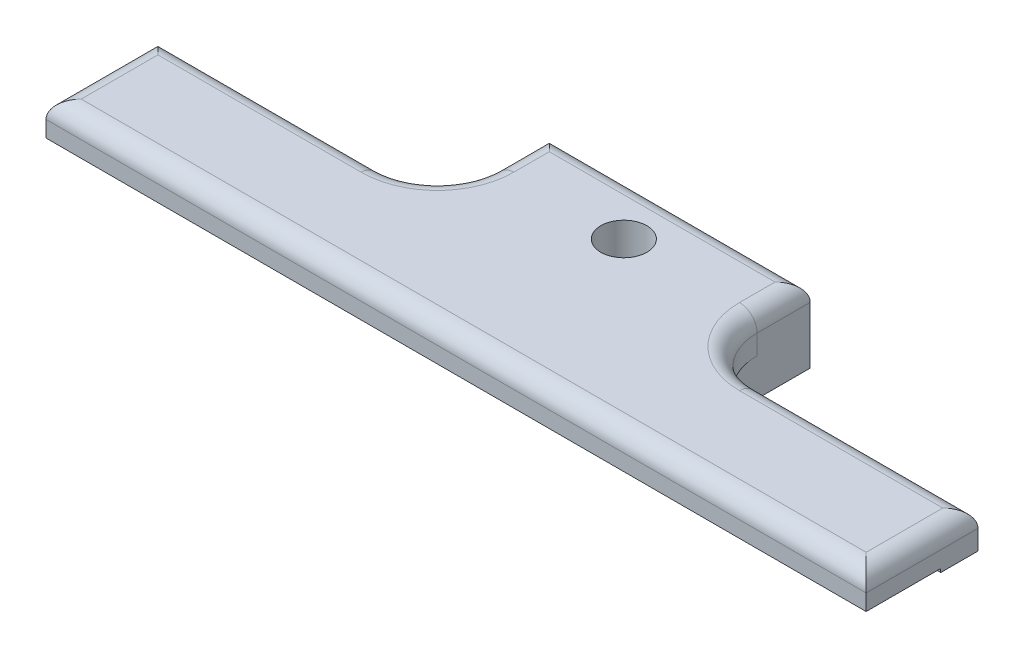
ISO-10303-21;
HEADER;
FILE_DESCRIPTION(('STEP AP214'),'2;1');
FILE_NAME('part.step','',(''),(''),'','','');
FILE_SCHEMA(('AUTOMOTIVE_DESIGN { 1 0 10303 214 1 1 1 1 }'));
ENDSEC;
DATA;
#1=APPLICATION_CONTEXT('core data for automotive mechanical design processes');
#2=APPLICATION_PROTOCOL_DEFINITION('international standard','automotive_design',2000,#1);
#3=PRODUCT_CONTEXT('',#1,'mechanical');
#4=PRODUCT('Part','Part','',(#3));
#5=PRODUCT_RELATED_PRODUCT_CATEGORY('part','',(#4));
#6=PRODUCT_DEFINITION_FORMATION('','',#4);
#7=PRODUCT_DEFINITION_CONTEXT('part definition',#1,'design');
#8=PRODUCT_DEFINITION('design','',#6,#7);
#9=PRODUCT_DEFINITION_SHAPE('','',#8);
#10=(LENGTH_UNIT() NAMED_UNIT(*) SI_UNIT(.MILLI.,.METRE.));
#11=(NAMED_UNIT(*) PLANE_ANGLE_UNIT() SI_UNIT($,.RADIAN.));
#12=(NAMED_UNIT(*) SI_UNIT($,.STERADIAN.) SOLID_ANGLE_UNIT());
#13=UNCERTAINTY_MEASURE_WITH_UNIT(LENGTH_MEASURE(1.E-05),#10,'distance_accuracy_value','');
#14=(GEOMETRIC_REPRESENTATION_CONTEXT(3) GLOBAL_UNCERTAINTY_ASSIGNED_CONTEXT((#13)) GLOBAL_UNIT_ASSIGNED_CONTEXT((#10,
#11,#12)) REPRESENTATION_CONTEXT('',''));
#15=CARTESIAN_POINT('',(0.,0.,0.));
#16=DIRECTION('',(0.,0.,1.));
#17=DIRECTION('',(1.,0.,0.));
#18=AXIS2_PLACEMENT_3D('',#15,#16,#17);
#19=CARTESIAN_POINT('',(0.,0.,0.));
#20=DIRECTION('',(0.,1.,0.));
#21=DIRECTION('',(0.,0.,1.));
#22=AXIS2_PLACEMENT_3D('',#19,#20,#21);
#23=PLANE('',#22);
#24=CARTESIAN_POINT('',(0.,0.,0.));
#25=DIRECTION('',(0.,1.,0.));
#26=DIRECTION('',(0.,0.,1.));
#27=AXIS2_PLACEMENT_3D('',#24,#25,#26);
#28=CIRCLE('',#27,3.925);
#29=CARTESIAN_POINT('',(0.,0.,3.925));
#30=VERTEX_POINT('',#29);
#31=EDGE_CURVE('E298',#30,#30,#28,.T.);
#32=ORIENTED_EDGE('',*,*,#31,.T.);
#33=EDGE_LOOP('',(#32));
#34=FACE_BOUND('',#33,.T.);
#35=DIRECTION('',(-1.,0.,0.));
#36=VECTOR('',#35,1.);
#37=CARTESIAN_POINT('',(-19.1262,0.,9.525));
#38=LINE('',#37,#36);
#39=CARTESIAN_POINT('',(-18.1262,0.,9.525));
#40=VERTEX_POINT('',#39);
#41=CARTESIAN_POINT('',(-22.225,0.,9.525));
#42=VERTEX_POINT('',#41);
#43=EDGE_CURVE('E218',#40,#42,#38,.T.);
#44=ORIENTED_EDGE('',*,*,#43,.F.);
#45=DIRECTION('',(0.,0.,1.));
#46=VECTOR('',#45,1.);
#47=CARTESIAN_POINT('',(-18.1262,0.,-9.525));
#48=LINE('',#47,#46);
#49=CARTESIAN_POINT('',(-18.1262,0.,-9.525));
#50=VERTEX_POINT('',#49);
#51=EDGE_CURVE('E482',#40,#50,#48,.F.);
#52=ORIENTED_EDGE('',*,*,#51,.T.);
#53=DIRECTION('',(1.,0.,0.));
#54=VECTOR('',#53,1.);
#55=CARTESIAN_POINT('',(0.,0.,-9.525));
#56=LINE('',#55,#54);
#57=CARTESIAN_POINT('',(18.1262,0.,-9.525));
#58=VERTEX_POINT('',#57);
#59=EDGE_CURVE('E321',#50,#58,#56,.T.);
#60=ORIENTED_EDGE('',*,*,#59,.T.);
#61=DIRECTION('',(0.,0.,1.));
#62=VECTOR('',#61,1.);
#63=CARTESIAN_POINT('',(18.1262,0.,0.));
#64=LINE('',#63,#62);
#65=CARTESIAN_POINT('',(18.1262,0.,9.525));
#66=VERTEX_POINT('',#65);
#67=EDGE_CURVE('E478',#58,#66,#64,.T.);
#68=ORIENTED_EDGE('',*,*,#67,.T.);
#69=DIRECTION('',(1.,0.,0.));
#70=VECTOR('',#69,1.);
#71=CARTESIAN_POINT('',(19.1262,0.,9.525));
#72=LINE('',#71,#70);
#73=CARTESIAN_POINT('',(22.225,0.,9.525));
#74=VERTEX_POINT('',#73);
#75=EDGE_CURVE('E230',#66,#74,#72,.T.);
#76=ORIENTED_EDGE('',*,*,#75,.T.);
#77=DIRECTION('',(0.,0.,1.));
#78=VECTOR('',#77,1.);
#79=CARTESIAN_POINT('',(22.225,0.,0.));
#80=LINE('',#79,#78);
#81=CARTESIAN_POINT('',(22.225,0.,-0.475));
#82=VERTEX_POINT('',#81);
#83=EDGE_CURVE('E214',#82,#74,#80,.T.);
#84=ORIENTED_EDGE('',*,*,#83,.F.);
#85=CARTESIAN_POINT('',(32.225,0.,-0.475));
#86=DIRECTION('',(0.,1.,0.));
#87=DIRECTION('',(0.,0.,1.));
#88=AXIS2_PLACEMENT_3D('',#85,#86,#87);
#89=CIRCLE('',#88,10.);
#90=CARTESIAN_POINT('',(32.225,0.,9.525));
#91=VERTEX_POINT('',#90);
#92=EDGE_CURVE('E369',#82,#91,#89,.T.);
#93=ORIENTED_EDGE('',*,*,#92,.T.);
#94=DIRECTION('',(1.,0.,0.));
#95=VECTOR('',#94,1.);
#96=CARTESIAN_POINT('',(0.,0.,9.525));
#97=LINE('',#96,#95);
#98=CARTESIAN_POINT('',(69.85,0.,9.525));
#99=VERTEX_POINT('',#98);
#100=EDGE_CURVE('E317',#91,#99,#97,.T.);
#101=ORIENTED_EDGE('',*,*,#100,.T.);
#102=DIRECTION('',(0.,0.,-1.));
#103=VECTOR('',#102,1.);
#104=CARTESIAN_POINT('',(69.85,0.,0.));
#105=LINE('',#104,#103);
#106=CARTESIAN_POINT('',(69.85,0.,15.875));
#107=VERTEX_POINT('',#106);
#108=EDGE_CURVE('E313',#107,#99,#105,.T.);
#109=ORIENTED_EDGE('',*,*,#108,.F.);
#110=DIRECTION('',(1.,0.,0.));
#111=VECTOR('',#110,1.);
#112=CARTESIAN_POINT('',(-69.85,0.,15.875));
#113=LINE('',#112,#111);
#114=CARTESIAN_POINT('',(-69.85,0.,15.875));
#115=VERTEX_POINT('',#114);
#116=EDGE_CURVE('E287',#115,#107,#113,.T.);
#117=ORIENTED_EDGE('',*,*,#116,.F.);
#118=DIRECTION('',(0.,0.,-1.));
#119=VECTOR('',#118,1.);
#120=CARTESIAN_POINT('',(-69.85,0.,0.));
#121=LINE('',#120,#119);
#122=CARTESIAN_POINT('',(-69.85,0.,9.525));
#123=VERTEX_POINT('',#122);
#124=EDGE_CURVE('E309',#115,#123,#121,.T.);
#125=ORIENTED_EDGE('',*,*,#124,.T.);
#126=DIRECTION('',(1.,0.,0.));
#127=VECTOR('',#126,1.);
#128=CARTESIAN_POINT('',(0.,0.,9.525));
#129=LINE('',#128,#127);
#130=CARTESIAN_POINT('',(-32.225,0.,9.525));
#131=VERTEX_POINT('',#130);
#132=EDGE_CURVE('E325',#123,#131,#129,.T.);
#133=ORIENTED_EDGE('',*,*,#132,.T.);
#134=CARTESIAN_POINT('',(-32.225,0.,-0.475000000000001));
#135=DIRECTION('',(0.,1.,0.));
#136=DIRECTION('',(0.,0.,1.));
#137=AXIS2_PLACEMENT_3D('',#134,#135,#136);
#138=CIRCLE('',#137,10.);
#139=CARTESIAN_POINT('',(-22.225,0.,-0.475000000000001));
#140=VERTEX_POINT('',#139);
#141=EDGE_CURVE('E372',#131,#140,#138,.T.);
#142=ORIENTED_EDGE('',*,*,#141,.T.);
#143=DIRECTION('',(0.,0.,-1.));
#144=VECTOR('',#143,1.);
#145=CARTESIAN_POINT('',(-22.225,0.,0.));
#146=LINE('',#145,#144);
#147=EDGE_CURVE('E365',#42,#140,#146,.T.);
#148=ORIENTED_EDGE('',*,*,#147,.F.);
#149=EDGE_LOOP('',(#44,#52,#60,#68,#76,#84,#93,#101,#109,#117,#125,#133,#142,#148));
#150=FACE_BOUND('',#149,.T.);
#151=ADVANCED_FACE('F41',(#34,#150),#23,.F.);
#152=CARTESIAN_POINT('',(0.,6.35,28.575));
#153=DIRECTION('',(0.,0.,-1.));
#154=DIRECTION('',(-1.,0.,0.));
#155=AXIS2_PLACEMENT_3D('',#152,#153,#154);
#156=PLANE('',#155);
#157=DIRECTION('',(0.,-1.,0.));
#158=VECTOR('',#157,1.);
#159=CARTESIAN_POINT('',(69.85,6.35,28.575));
#160=LINE('',#159,#158);
#161=CARTESIAN_POINT('',(69.85,3.35,28.575));
#162=VERTEX_POINT('',#161);
#163=CARTESIAN_POINT('',(69.85,0.599999999999998,28.575));
#164=VERTEX_POINT('',#163);
#165=EDGE_CURVE('E346',#162,#164,#160,.T.);
#166=ORIENTED_EDGE('',*,*,#165,.F.);
#167=DIRECTION('',(1.,0.,0.));
#168=VECTOR('',#167,1.);
#169=CARTESIAN_POINT('',(-69.85,3.35,28.575));
#170=LINE('',#169,#168);
#171=CARTESIAN_POINT('',(-69.85,3.35,28.575));
#172=VERTEX_POINT('',#171);
#173=EDGE_CURVE('E434',#162,#172,#170,.F.);
#174=ORIENTED_EDGE('',*,*,#173,.T.);
#175=DIRECTION('',(0.,-1.,0.));
#176=VECTOR('',#175,1.);
#177=CARTESIAN_POINT('',(-69.85,6.35,28.575));
#178=LINE('',#177,#176);
#179=CARTESIAN_POINT('',(-69.85,0.599999999999998,28.575));
#180=VERTEX_POINT('',#179);
#181=EDGE_CURVE('E308',#172,#180,#178,.T.);
#182=ORIENTED_EDGE('',*,*,#181,.T.);
#183=DIRECTION('',(1.,0.,0.));
#184=VECTOR('',#183,1.);
#185=CARTESIAN_POINT('',(-69.85,0.599999999999998,28.575));
#186=LINE('',#185,#184);
#187=EDGE_CURVE('E294',#180,#164,#186,.T.);
#188=ORIENTED_EDGE('',*,*,#187,.T.);
#189=EDGE_LOOP('',(#166,#174,#182,#188));
#190=FACE_BOUND('',#189,.T.);
#191=ADVANCED_FACE('F568',(#190),#156,.F.);
#192=CARTESIAN_POINT('',(69.85,6.35,0.));
#193=DIRECTION('',(-1.,0.,0.));
#194=DIRECTION('',(0.,0.,1.));
#195=AXIS2_PLACEMENT_3D('',#192,#193,#194);
#196=PLANE('',#195);
#197=DIRECTION('',(0.,-1.,0.));
#198=VECTOR('',#197,1.);
#199=CARTESIAN_POINT('',(69.85,6.35,9.525));
#200=LINE('',#199,#198);
#201=CARTESIAN_POINT('',(69.85,3.35,9.525));
#202=VERTEX_POINT('',#201);
#203=EDGE_CURVE('E343',#202,#99,#200,.T.);
#204=ORIENTED_EDGE('',*,*,#203,.F.);
#205=DIRECTION('',(0.,0.,-1.));
#206=VECTOR('',#205,1.);
#207=CARTESIAN_POINT('',(69.85,3.35,28.575));
#208=LINE('',#207,#206);
#209=EDGE_CURVE('E431',#202,#162,#208,.F.);
#210=ORIENTED_EDGE('',*,*,#209,.T.);
#211=ORIENTED_EDGE('',*,*,#165,.T.);
#212=DIRECTION('',(0.,0.,1.));
#213=VECTOR('',#212,1.);
#214=CARTESIAN_POINT('',(69.85,0.6,15.875));
#215=LINE('',#214,#213);
#216=CARTESIAN_POINT('',(69.85,0.6,15.875));
#217=VERTEX_POINT('',#216);
#218=EDGE_CURVE('E283',#217,#164,#215,.T.);
#219=ORIENTED_EDGE('',*,*,#218,.F.);
#220=DIRECTION('',(0.,1.,0.));
#221=VECTOR('',#220,1.);
#222=CARTESIAN_POINT('',(69.85,0.,15.875));
#223=LINE('',#222,#221);
#224=EDGE_CURVE('E277',#107,#217,#223,.T.);
#225=ORIENTED_EDGE('',*,*,#224,.F.);
#226=ORIENTED_EDGE('',*,*,#108,.T.);
#227=EDGE_LOOP('',(#204,#210,#211,#219,#225,#226));
#228=FACE_BOUND('',#227,.T.);
#229=ADVANCED_FACE('F553',(#228),#196,.F.);
#230=CARTESIAN_POINT('',(0.,6.35,9.525));
#231=DIRECTION('',(0.,0.,-1.));
#232=DIRECTION('',(-1.,0.,0.));
#233=AXIS2_PLACEMENT_3D('',#230,#231,#232);
#234=PLANE('',#233);
#235=DIRECTION('',(0.,-1.,0.));
#236=VECTOR('',#235,1.);
#237=CARTESIAN_POINT('',(32.225,6.35,9.525));
#238=LINE('',#237,#236);
#239=CARTESIAN_POINT('',(32.225,3.35,9.525));
#240=VERTEX_POINT('',#239);
#241=EDGE_CURVE('E354',#91,#240,#238,.F.);
#242=ORIENTED_EDGE('',*,*,#241,.T.);
#243=DIRECTION('',(1.,0.,0.));
#244=VECTOR('',#243,1.);
#245=CARTESIAN_POINT('',(0.,3.35,9.525));
#246=LINE('',#245,#244);
#247=EDGE_CURVE('E416',#240,#202,#246,.T.);
#248=ORIENTED_EDGE('',*,*,#247,.T.);
#249=ORIENTED_EDGE('',*,*,#203,.T.);
#250=ORIENTED_EDGE('',*,*,#100,.F.);
#251=EDGE_LOOP('',(#242,#248,#249,#250));
#252=FACE_BOUND('',#251,.T.);
#253=ADVANCED_FACE('F549',(#252),#234,.T.);
#254=CARTESIAN_POINT('',(22.225,6.35,0.));
#255=DIRECTION('',(-1.,0.,0.));
#256=DIRECTION('',(0.,0.,1.));
#257=AXIS2_PLACEMENT_3D('',#254,#255,#256);
#258=PLANE('',#257);
#259=DIRECTION('',(0.,-1.,0.));
#260=VECTOR('',#259,1.);
#261=CARTESIAN_POINT('',(22.225,6.35,-9.525));
#262=LINE('',#261,#260);
#263=CARTESIAN_POINT('',(22.225,3.35,-9.525));
#264=VERTEX_POINT('',#263);
#265=CARTESIAN_POINT('',(22.225,-6.35,-9.525));
#266=VERTEX_POINT('',#265);
#267=EDGE_CURVE('E340',#264,#266,#262,.T.);
#268=ORIENTED_EDGE('',*,*,#267,.F.);
#269=DIRECTION('',(0.,0.,-1.));
#270=VECTOR('',#269,1.);
#271=CARTESIAN_POINT('',(22.225,3.35,-0.475));
#272=LINE('',#271,#270);
#273=CARTESIAN_POINT('',(22.225,3.35,-0.475));
#274=VERTEX_POINT('',#273);
#275=EDGE_CURVE('E419',#264,#274,#272,.F.);
#276=ORIENTED_EDGE('',*,*,#275,.T.);
#277=DIRECTION('',(0.,-1.,0.));
#278=VECTOR('',#277,1.);
#279=CARTESIAN_POINT('',(22.225,6.35,-0.475));
#280=LINE('',#279,#278);
#281=EDGE_CURVE('E351',#274,#82,#280,.T.);
#282=ORIENTED_EDGE('',*,*,#281,.T.);
#283=ORIENTED_EDGE('',*,*,#83,.T.);
#284=DIRECTION('',(0.,1.,0.));
#285=VECTOR('',#284,1.);
#286=CARTESIAN_POINT('',(22.225,-6.35,9.525));
#287=LINE('',#286,#285);
#288=CARTESIAN_POINT('',(22.225,-6.35,9.525));
#289=VERTEX_POINT('',#288);
#290=EDGE_CURVE('E207',#289,#74,#287,.T.);
#291=ORIENTED_EDGE('',*,*,#290,.F.);
#292=DIRECTION('',(0.,0.,-1.));
#293=VECTOR('',#292,1.);
#294=CARTESIAN_POINT('',(22.225,-6.35,9.525));
#295=LINE('',#294,#293);
#296=EDGE_CURVE('E211',#289,#266,#295,.T.);
#297=ORIENTED_EDGE('',*,*,#296,.T.);
#298=EDGE_LOOP('',(#268,#276,#282,#283,#291,#297));
#299=FACE_BOUND('',#298,.T.);
#300=ADVANCED_FACE('F210',(#299),#258,.F.);
#301=CARTESIAN_POINT('',(0.,6.35,-9.525));
#302=DIRECTION('',(0.,0.,-1.));
#303=DIRECTION('',(-1.,0.,0.));
#304=AXIS2_PLACEMENT_3D('',#301,#302,#303);
#305=PLANE('',#304);
#306=DIRECTION('',(0.,-1.,0.));
#307=VECTOR('',#306,1.);
#308=CARTESIAN_POINT('',(-22.225,6.35,-9.525));
#309=LINE('',#308,#307);
#310=CARTESIAN_POINT('',(-22.225,3.35,-9.525));
#311=VERTEX_POINT('',#310);
#312=CARTESIAN_POINT('',(-22.225,-6.35,-9.525));
#313=VERTEX_POINT('',#312);
#314=EDGE_CURVE('E337',#311,#313,#309,.T.);
#315=ORIENTED_EDGE('',*,*,#314,.F.);
#316=DIRECTION('',(1.,0.,0.));
#317=VECTOR('',#316,1.);
#318=CARTESIAN_POINT('',(0.,3.35,-9.525));
#319=LINE('',#318,#317);
#320=EDGE_CURVE('E413',#311,#264,#319,.T.);
#321=ORIENTED_EDGE('',*,*,#320,.T.);
#322=ORIENTED_EDGE('',*,*,#267,.T.);
#323=DIRECTION('',(-1.,0.,0.));
#324=VECTOR('',#323,1.);
#325=CARTESIAN_POINT('',(22.225,-6.35,-9.525));
#326=LINE('',#325,#324);
#327=CARTESIAN_POINT('',(19.1262,-6.35,-9.525));
#328=VERTEX_POINT('',#327);
#329=EDGE_CURVE('E228',#266,#328,#326,.T.);
#330=ORIENTED_EDGE('',*,*,#329,.T.);
#331=DIRECTION('',(0.,1.,0.));
#332=VECTOR('',#331,1.);
#333=CARTESIAN_POINT('',(19.1262,-6.35,-9.525));
#334=LINE('',#333,#332);
#335=CARTESIAN_POINT('',(19.1262,-1.,-9.525));
#336=VERTEX_POINT('',#335);
#337=EDGE_CURVE('E241',#328,#336,#334,.T.);
#338=ORIENTED_EDGE('',*,*,#337,.T.);
#339=CARTESIAN_POINT('',(18.1262,-1.,-9.525));
#340=DIRECTION('',(0.,0.,-1.));
#341=DIRECTION('',(-1.,0.,0.));
#342=AXIS2_PLACEMENT_3D('',#339,#340,#341);
#343=CIRCLE('',#342,1.);
#344=EDGE_CURVE('E11',#336,#58,#343,.F.);
#345=ORIENTED_EDGE('',*,*,#344,.T.);
#346=ORIENTED_EDGE('',*,*,#59,.F.);
#347=CARTESIAN_POINT('',(-18.1262,-1.,-9.525));
#348=DIRECTION('',(0.,0.,-1.));
#349=DIRECTION('',(-1.,0.,0.));
#350=AXIS2_PLACEMENT_3D('',#347,#348,#349);
#351=CIRCLE('',#350,1.);
#352=CARTESIAN_POINT('',(-19.1262,-1.,-9.525));
#353=VERTEX_POINT('',#352);
#354=EDGE_CURVE('E491',#50,#353,#351,.F.);
#355=ORIENTED_EDGE('',*,*,#354,.T.);
#356=DIRECTION('',(0.,1.,0.));
#357=VECTOR('',#356,1.);
#358=CARTESIAN_POINT('',(-19.1262,-6.35,-9.525));
#359=LINE('',#358,#357);
#360=CARTESIAN_POINT('',(-19.1262,-6.35,-9.525));
#361=VERTEX_POINT('',#360);
#362=EDGE_CURVE('E273',#361,#353,#359,.T.);
#363=ORIENTED_EDGE('',*,*,#362,.F.);
#364=DIRECTION('',(1.,0.,0.));
#365=VECTOR('',#364,1.);
#366=CARTESIAN_POINT('',(-22.225,-6.35,-9.525));
#367=LINE('',#366,#365);
#368=EDGE_CURVE('E253',#313,#361,#367,.T.);
#369=ORIENTED_EDGE('',*,*,#368,.F.);
#370=EDGE_LOOP('',(#315,#321,#322,#330,#338,#345,#346,#355,#363,#369));
#371=FACE_BOUND('',#370,.T.);
#372=ADVANCED_FACE('F499',(#371),#305,.T.);
#373=CARTESIAN_POINT('',(-22.225,6.35,0.));
#374=DIRECTION('',(-1.,0.,0.));
#375=DIRECTION('',(0.,0.,1.));
#376=AXIS2_PLACEMENT_3D('',#373,#374,#375);
#377=PLANE('',#376);
#378=DIRECTION('',(0.,-1.,0.));
#379=VECTOR('',#378,1.);
#380=CARTESIAN_POINT('',(-22.225,6.35,-0.475000000000001));
#381=LINE('',#380,#379);
#382=CARTESIAN_POINT('',(-22.225,3.35,-0.475000000000001));
#383=VERTEX_POINT('',#382);
#384=EDGE_CURVE('E361',#140,#383,#381,.F.);
#385=ORIENTED_EDGE('',*,*,#384,.T.);
#386=DIRECTION('',(0.,0.,-1.));
#387=VECTOR('',#386,1.);
#388=CARTESIAN_POINT('',(-22.225,3.35,0.));
#389=LINE('',#388,#387);
#390=EDGE_CURVE('E422',#383,#311,#389,.T.);
#391=ORIENTED_EDGE('',*,*,#390,.T.);
#392=ORIENTED_EDGE('',*,*,#314,.T.);
#393=DIRECTION('',(0.,0.,-1.));
#394=VECTOR('',#393,1.);
#395=CARTESIAN_POINT('',(-22.225,-6.35,9.525));
#396=LINE('',#395,#394);
#397=CARTESIAN_POINT('',(-22.225,-6.35,9.525));
#398=VERTEX_POINT('',#397);
#399=EDGE_CURVE('E249',#398,#313,#396,.T.);
#400=ORIENTED_EDGE('',*,*,#399,.F.);
#401=DIRECTION('',(0.,1.,0.));
#402=VECTOR('',#401,1.);
#403=CARTESIAN_POINT('',(-22.225,-6.35,9.525));
#404=LINE('',#403,#402);
#405=EDGE_CURVE('E262',#398,#42,#404,.T.);
#406=ORIENTED_EDGE('',*,*,#405,.T.);
#407=ORIENTED_EDGE('',*,*,#147,.T.);
#408=EDGE_LOOP('',(#385,#391,#392,#400,#406,#407));
#409=FACE_BOUND('',#408,.T.);
#410=ADVANCED_FACE('F604',(#409),#377,.T.);
#411=CARTESIAN_POINT('',(0.,6.35,9.525));
#412=DIRECTION('',(0.,0.,-1.));
#413=DIRECTION('',(-1.,0.,0.));
#414=AXIS2_PLACEMENT_3D('',#411,#412,#413);
#415=PLANE('',#414);
#416=DIRECTION('',(0.,-1.,0.));
#417=VECTOR('',#416,1.);
#418=CARTESIAN_POINT('',(-69.85,6.35,9.525));
#419=LINE('',#418,#417);
#420=CARTESIAN_POINT('',(-69.85,3.35,9.525));
#421=VERTEX_POINT('',#420);
#422=EDGE_CURVE('E334',#421,#123,#419,.T.);
#423=ORIENTED_EDGE('',*,*,#422,.F.);
#424=DIRECTION('',(1.,0.,0.));
#425=VECTOR('',#424,1.);
#426=CARTESIAN_POINT('',(0.,3.35,9.525));
#427=LINE('',#426,#425);
#428=CARTESIAN_POINT('',(-32.225,3.35,9.525));
#429=VERTEX_POINT('',#428);
#430=EDGE_CURVE('E425',#421,#429,#427,.T.);
#431=ORIENTED_EDGE('',*,*,#430,.T.);
#432=DIRECTION('',(0.,-1.,0.));
#433=VECTOR('',#432,1.);
#434=CARTESIAN_POINT('',(-32.225,0.,9.525));
#435=LINE('',#434,#433);
#436=EDGE_CURVE('E358',#429,#131,#435,.T.);
#437=ORIENTED_EDGE('',*,*,#436,.T.);
#438=ORIENTED_EDGE('',*,*,#132,.F.);
#439=EDGE_LOOP('',(#423,#431,#437,#438));
#440=FACE_BOUND('',#439,.T.);
#441=ADVANCED_FACE('F587',(#440),#415,.T.);
#442=CARTESIAN_POINT('',(0.,6.35,0.));
#443=DIRECTION('',(0.,-1.,0.));
#444=DIRECTION('',(0.,0.,-1.));
#445=AXIS2_PLACEMENT_3D('',#442,#443,#444);
#446=CYLINDRICAL_SURFACE('',#445,3.925);
#447=CARTESIAN_POINT('',(0.,6.35,0.));
#448=DIRECTION('',(0.,1.,0.));
#449=DIRECTION('',(0.,0.,1.));
#450=AXIS2_PLACEMENT_3D('',#447,#448,#449);
#451=CIRCLE('',#450,3.925);
#452=CARTESIAN_POINT('',(0.,6.35,3.925));
#453=VERTEX_POINT('',#452);
#454=EDGE_CURVE('E304',#453,#453,#451,.T.);
#455=ORIENTED_EDGE('',*,*,#454,.T.);
#456=EDGE_LOOP('',(#455));
#457=FACE_BOUND('',#456,.T.);
#458=ORIENTED_EDGE('',*,*,#31,.F.);
#459=EDGE_LOOP('',(#458));
#460=FACE_BOUND('',#459,.T.);
#461=ADVANCED_FACE('F612',(#457,#460),#446,.F.);
#462=CARTESIAN_POINT('',(-69.85,6.35,0.));
#463=DIRECTION('',(-1.,0.,0.));
#464=DIRECTION('',(0.,0.,1.));
#465=AXIS2_PLACEMENT_3D('',#462,#463,#464);
#466=PLANE('',#465);
#467=ORIENTED_EDGE('',*,*,#181,.F.);
#468=DIRECTION('',(0.,0.,-1.));
#469=VECTOR('',#468,1.);
#470=CARTESIAN_POINT('',(-69.85,3.35,0.));
#471=LINE('',#470,#469);
#472=EDGE_CURVE('E428',#172,#421,#471,.T.);
#473=ORIENTED_EDGE('',*,*,#472,.T.);
#474=ORIENTED_EDGE('',*,*,#422,.T.);
#475=ORIENTED_EDGE('',*,*,#124,.F.);
#476=DIRECTION('',(0.,1.,0.));
#477=VECTOR('',#476,1.);
#478=CARTESIAN_POINT('',(-69.85,0.,15.875));
#479=LINE('',#478,#477);
#480=CARTESIAN_POINT('',(-69.85,0.6,15.875));
#481=VERTEX_POINT('',#480);
#482=EDGE_CURVE('E278',#115,#481,#479,.T.);
#483=ORIENTED_EDGE('',*,*,#482,.T.);
#484=DIRECTION('',(0.,0.,1.));
#485=VECTOR('',#484,1.);
#486=CARTESIAN_POINT('',(-69.85,0.6,15.875));
#487=LINE('',#486,#485);
#488=EDGE_CURVE('E282',#481,#180,#487,.T.);
#489=ORIENTED_EDGE('',*,*,#488,.T.);
#490=EDGE_LOOP('',(#467,#473,#474,#475,#483,#489));
#491=FACE_BOUND('',#490,.T.);
#492=ADVANCED_FACE('F572',(#491),#466,.T.);
#493=CARTESIAN_POINT('',(0.,6.35,0.));
#494=DIRECTION('',(0.,1.,0.));
#495=DIRECTION('',(0.,0.,1.));
#496=AXIS2_PLACEMENT_3D('',#493,#494,#495);
#497=PLANE('',#496);
#498=DIRECTION('',(0.,0.,-1.));
#499=VECTOR('',#498,1.);
#500=CARTESIAN_POINT('',(19.225,6.35,-9.525));
#501=LINE('',#500,#499);
#502=CARTESIAN_POINT('',(19.225,6.35,-0.475));
#503=VERTEX_POINT('',#502);
#504=CARTESIAN_POINT('',(19.225,6.35,-6.525));
#505=VERTEX_POINT('',#504);
#506=EDGE_CURVE('E400',#503,#505,#501,.T.);
#507=ORIENTED_EDGE('',*,*,#506,.T.);
#508=DIRECTION('',(1.,0.,0.));
#509=VECTOR('',#508,1.);
#510=CARTESIAN_POINT('',(0.,6.35,-6.525));
#511=LINE('',#510,#509);
#512=CARTESIAN_POINT('',(-19.225,6.35,-6.525));
#513=VERTEX_POINT('',#512);
#514=EDGE_CURVE('E403',#505,#513,#511,.F.);
#515=ORIENTED_EDGE('',*,*,#514,.T.);
#516=DIRECTION('',(0.,0.,-1.));
#517=VECTOR('',#516,1.);
#518=CARTESIAN_POINT('',(-19.225,6.35,0.));
#519=LINE('',#518,#517);
#520=CARTESIAN_POINT('',(-19.225,6.35,-0.475000000000001));
#521=VERTEX_POINT('',#520);
#522=EDGE_CURVE('E397',#513,#521,#519,.F.);
#523=ORIENTED_EDGE('',*,*,#522,.T.);
#524=CARTESIAN_POINT('',(-32.225,6.35,-0.475000000000001));
#525=DIRECTION('',(0.,1.,0.));
#526=DIRECTION('',(0.,0.,1.));
#527=AXIS2_PLACEMENT_3D('',#524,#525,#526);
#528=CIRCLE('',#527,13.);
#529=CARTESIAN_POINT('',(-32.225,6.35,12.525));
#530=VERTEX_POINT('',#529);
#531=EDGE_CURVE('E390',#521,#530,#528,.F.);
#532=ORIENTED_EDGE('',*,*,#531,.T.);
#533=DIRECTION('',(1.,0.,0.));
#534=VECTOR('',#533,1.);
#535=CARTESIAN_POINT('',(0.,6.35,12.525));
#536=LINE('',#535,#534);
#537=CARTESIAN_POINT('',(-66.85,6.35,12.525));
#538=VERTEX_POINT('',#537);
#539=EDGE_CURVE('E384',#530,#538,#536,.F.);
#540=ORIENTED_EDGE('',*,*,#539,.T.);
#541=DIRECTION('',(0.,0.,-1.));
#542=VECTOR('',#541,1.);
#543=CARTESIAN_POINT('',(-66.85,6.35,0.));
#544=LINE('',#543,#542);
#545=CARTESIAN_POINT('',(-66.85,6.35,25.575));
#546=VERTEX_POINT('',#545);
#547=EDGE_CURVE('E381',#538,#546,#544,.F.);
#548=ORIENTED_EDGE('',*,*,#547,.T.);
#549=DIRECTION('',(1.,0.,0.));
#550=VECTOR('',#549,1.);
#551=CARTESIAN_POINT('',(69.85,6.35,25.575));
#552=LINE('',#551,#550);
#553=CARTESIAN_POINT('',(66.85,6.35,25.575));
#554=VERTEX_POINT('',#553);
#555=EDGE_CURVE('E375',#546,#554,#552,.T.);
#556=ORIENTED_EDGE('',*,*,#555,.T.);
#557=DIRECTION('',(0.,0.,-1.));
#558=VECTOR('',#557,1.);
#559=CARTESIAN_POINT('',(66.85,6.35,9.525));
#560=LINE('',#559,#558);
#561=CARTESIAN_POINT('',(66.85,6.35,12.525));
#562=VERTEX_POINT('',#561);
#563=EDGE_CURVE('E378',#554,#562,#560,.T.);
#564=ORIENTED_EDGE('',*,*,#563,.T.);
#565=DIRECTION('',(1.,0.,0.));
#566=VECTOR('',#565,1.);
#567=CARTESIAN_POINT('',(0.,6.35,12.525));
#568=LINE('',#567,#566);
#569=CARTESIAN_POINT('',(32.225,6.35,12.525));
#570=VERTEX_POINT('',#569);
#571=EDGE_CURVE('E387',#562,#570,#568,.F.);
#572=ORIENTED_EDGE('',*,*,#571,.T.);
#573=CARTESIAN_POINT('',(32.225,6.35,-0.475));
#574=DIRECTION('',(0.,1.,0.));
#575=DIRECTION('',(0.,0.,1.));
#576=AXIS2_PLACEMENT_3D('',#573,#574,#575);
#577=CIRCLE('',#576,13.);
#578=EDGE_CURVE('E393',#570,#503,#577,.F.);
#579=ORIENTED_EDGE('',*,*,#578,.T.);
#580=EDGE_LOOP('',(#507,#515,#523,#532,#540,#548,#556,#564,#572,#579));
#581=FACE_BOUND('',#580,.T.);
#582=ORIENTED_EDGE('',*,*,#454,.F.);
#583=EDGE_LOOP('',(#582));
#584=FACE_BOUND('',#583,.T.);
#585=ADVANCED_FACE('F624',(#581,#584),#497,.T.);
#586=CARTESIAN_POINT('',(-69.85,0.6,15.875));
#587=DIRECTION('',(0.,1.,0.));
#588=DIRECTION('',(0.,0.,1.));
#589=AXIS2_PLACEMENT_3D('',#586,#587,#588);
#590=PLANE('',#589);
#591=ORIENTED_EDGE('',*,*,#218,.T.);
#592=ORIENTED_EDGE('',*,*,#187,.F.);
#593=ORIENTED_EDGE('',*,*,#488,.F.);
#594=DIRECTION('',(1.,0.,0.));
#595=VECTOR('',#594,1.);
#596=CARTESIAN_POINT('',(-69.85,0.6,15.875));
#597=LINE('',#596,#595);
#598=EDGE_CURVE('E299',#481,#217,#597,.T.);
#599=ORIENTED_EDGE('',*,*,#598,.T.);
#600=EDGE_LOOP('',(#591,#592,#593,#599));
#601=FACE_BOUND('',#600,.T.);
#602=ADVANCED_FACE('F600',(#601),#590,.F.);
#603=CARTESIAN_POINT('',(-69.85,0.,15.875));
#604=DIRECTION('',(0.,0.,-1.));
#605=DIRECTION('',(-1.,0.,0.));
#606=AXIS2_PLACEMENT_3D('',#603,#604,#605);
#607=PLANE('',#606);
#608=ORIENTED_EDGE('',*,*,#224,.T.);
#609=ORIENTED_EDGE('',*,*,#598,.F.);
#610=ORIENTED_EDGE('',*,*,#482,.F.);
#611=ORIENTED_EDGE('',*,*,#116,.T.);
#612=EDGE_LOOP('',(#608,#609,#610,#611));
#613=FACE_BOUND('',#612,.T.);
#614=ADVANCED_FACE('F597',(#613),#607,.F.);
#615=CARTESIAN_POINT('',(-19.1262,-6.35,-9.525));
#616=DIRECTION('',(-1.,0.,0.));
#617=DIRECTION('',(0.,0.,1.));
#618=AXIS2_PLACEMENT_3D('',#615,#616,#617);
#619=PLANE('',#618);
#620=ORIENTED_EDGE('',*,*,#362,.T.);
#621=DIRECTION('',(0.,0.,1.));
#622=VECTOR('',#621,1.);
#623=CARTESIAN_POINT('',(-19.1262,-1.,9.525));
#624=LINE('',#623,#622);
#625=CARTESIAN_POINT('',(-19.1262,-1.,9.525));
#626=VERTEX_POINT('',#625);
#627=EDGE_CURVE('E437',#353,#626,#624,.T.);
#628=ORIENTED_EDGE('',*,*,#627,.T.);
#629=DIRECTION('',(0.,1.,0.));
#630=VECTOR('',#629,1.);
#631=CARTESIAN_POINT('',(-19.1262,-6.35,9.525));
#632=LINE('',#631,#630);
#633=CARTESIAN_POINT('',(-19.1262,-6.35,9.525));
#634=VERTEX_POINT('',#633);
#635=EDGE_CURVE('E269',#634,#626,#632,.T.);
#636=ORIENTED_EDGE('',*,*,#635,.F.);
#637=DIRECTION('',(0.,0.,1.));
#638=VECTOR('',#637,1.);
#639=CARTESIAN_POINT('',(-19.1262,-6.35,-9.525));
#640=LINE('',#639,#638);
#641=EDGE_CURVE('E256',#361,#634,#640,.T.);
#642=ORIENTED_EDGE('',*,*,#641,.F.);
#643=EDGE_LOOP('',(#620,#628,#636,#642));
#644=FACE_BOUND('',#643,.T.);
#645=ADVANCED_FACE('F506',(#644),#619,.F.);
#646=CARTESIAN_POINT('',(-19.1262,-6.35,9.525));
#647=DIRECTION('',(0.,0.,-1.));
#648=DIRECTION('',(-1.,0.,0.));
#649=AXIS2_PLACEMENT_3D('',#646,#647,#648);
#650=PLANE('',#649);
#651=ORIENTED_EDGE('',*,*,#43,.T.);
#652=ORIENTED_EDGE('',*,*,#405,.F.);
#653=DIRECTION('',(-1.,0.,0.));
#654=VECTOR('',#653,1.);
#655=CARTESIAN_POINT('',(-19.1262,-6.35,9.525));
#656=LINE('',#655,#654);
#657=EDGE_CURVE('E259',#634,#398,#656,.T.);
#658=ORIENTED_EDGE('',*,*,#657,.F.);
#659=ORIENTED_EDGE('',*,*,#635,.T.);
#660=CARTESIAN_POINT('',(-18.1262,-1.,9.525));
#661=DIRECTION('',(0.,0.,-1.));
#662=DIRECTION('',(-1.,0.,0.));
#663=AXIS2_PLACEMENT_3D('',#660,#661,#662);
#664=CIRCLE('',#663,1.);
#665=EDGE_CURVE('E487',#626,#40,#664,.T.);
#666=ORIENTED_EDGE('',*,*,#665,.T.);
#667=EDGE_LOOP('',(#651,#652,#658,#659,#666));
#668=FACE_BOUND('',#667,.T.);
#669=ADVANCED_FACE('F510',(#668),#650,.F.);
#670=CARTESIAN_POINT('',(0.,-6.35,0.));
#671=DIRECTION('',(0.,-1.,0.));
#672=DIRECTION('',(0.,0.,-1.));
#673=AXIS2_PLACEMENT_3D('',#670,#671,#672);
#674=PLANE('',#673);
#675=ORIENTED_EDGE('',*,*,#399,.T.);
#676=ORIENTED_EDGE('',*,*,#368,.T.);
#677=ORIENTED_EDGE('',*,*,#641,.T.);
#678=ORIENTED_EDGE('',*,*,#657,.T.);
#679=EDGE_LOOP('',(#675,#676,#677,#678));
#680=FACE_BOUND('',#679,.T.);
#681=ADVANCED_FACE('F515',(#680),#674,.T.);
#682=CARTESIAN_POINT('',(19.1262,-6.35,9.525));
#683=DIRECTION('',(0.,0.,1.));
#684=DIRECTION('',(1.,0.,0.));
#685=AXIS2_PLACEMENT_3D('',#682,#683,#684);
#686=PLANE('',#685);
#687=ORIENTED_EDGE('',*,*,#75,.F.);
#688=CARTESIAN_POINT('',(18.1262,-1.,9.525));
#689=DIRECTION('',(0.,0.,1.));
#690=DIRECTION('',(1.,0.,0.));
#691=AXIS2_PLACEMENT_3D('',#688,#689,#690);
#692=CIRCLE('',#691,1.);
#693=CARTESIAN_POINT('',(19.1262,-1.,9.525));
#694=VERTEX_POINT('',#693);
#695=EDGE_CURVE('E50',#66,#694,#692,.F.);
#696=ORIENTED_EDGE('',*,*,#695,.T.);
#697=DIRECTION('',(0.,1.,0.));
#698=VECTOR('',#697,1.);
#699=CARTESIAN_POINT('',(19.1262,-6.35,9.525));
#700=LINE('',#699,#698);
#701=CARTESIAN_POINT('',(19.1262,-6.35,9.525));
#702=VERTEX_POINT('',#701);
#703=EDGE_CURVE('E219',#702,#694,#700,.T.);
#704=ORIENTED_EDGE('',*,*,#703,.F.);
#705=DIRECTION('',(1.,0.,0.));
#706=VECTOR('',#705,1.);
#707=CARTESIAN_POINT('',(19.1262,-6.35,9.525));
#708=LINE('',#707,#706);
#709=EDGE_CURVE('E225',#702,#289,#708,.T.);
#710=ORIENTED_EDGE('',*,*,#709,.T.);
#711=ORIENTED_EDGE('',*,*,#290,.T.);
#712=EDGE_LOOP('',(#687,#696,#704,#710,#711));
#713=FACE_BOUND('',#712,.T.);
#714=ADVANCED_FACE('F232',(#713),#686,.T.);
#715=CARTESIAN_POINT('',(19.1262,-6.35,-9.525));
#716=DIRECTION('',(-1.,0.,0.));
#717=DIRECTION('',(0.,0.,1.));
#718=AXIS2_PLACEMENT_3D('',#715,#716,#717);
#719=PLANE('',#718);
#720=ORIENTED_EDGE('',*,*,#703,.T.);
#721=DIRECTION('',(0.,0.,1.));
#722=VECTOR('',#721,1.);
#723=CARTESIAN_POINT('',(19.1262,-1.,-9.525));
#724=LINE('',#723,#722);
#725=EDGE_CURVE('E63',#694,#336,#724,.F.);
#726=ORIENTED_EDGE('',*,*,#725,.T.);
#727=ORIENTED_EDGE('',*,*,#337,.F.);
#728=DIRECTION('',(0.,0.,1.));
#729=VECTOR('',#728,1.);
#730=CARTESIAN_POINT('',(19.1262,-6.35,-9.525));
#731=LINE('',#730,#729);
#732=EDGE_CURVE('E234',#328,#702,#731,.T.);
#733=ORIENTED_EDGE('',*,*,#732,.T.);
#734=EDGE_LOOP('',(#720,#726,#727,#733));
#735=FACE_BOUND('',#734,.T.);
#736=ADVANCED_FACE('F680',(#735),#719,.T.);
#737=CARTESIAN_POINT('',(0.,-6.35,0.));
#738=DIRECTION('',(0.,-1.,0.));
#739=DIRECTION('',(0.,0.,-1.));
#740=AXIS2_PLACEMENT_3D('',#737,#738,#739);
#741=PLANE('',#740);
#742=ORIENTED_EDGE('',*,*,#296,.F.);
#743=ORIENTED_EDGE('',*,*,#709,.F.);
#744=ORIENTED_EDGE('',*,*,#732,.F.);
#745=ORIENTED_EDGE('',*,*,#329,.F.);
#746=EDGE_LOOP('',(#742,#743,#744,#745));
#747=FACE_BOUND('',#746,.T.);
#748=ADVANCED_FACE('F223',(#747),#741,.T.);
#749=CARTESIAN_POINT('',(32.225,6.35,-0.475));
#750=DIRECTION('',(0.,-1.,0.));
#751=DIRECTION('',(0.,0.,-1.));
#752=AXIS2_PLACEMENT_3D('',#749,#750,#751);
#753=CYLINDRICAL_SURFACE('',#752,10.);
#754=ORIENTED_EDGE('',*,*,#281,.F.);
#755=CARTESIAN_POINT('',(32.225,3.35,-0.475));
#756=DIRECTION('',(0.,1.,0.));
#757=DIRECTION('',(0.,0.,1.));
#758=AXIS2_PLACEMENT_3D('',#755,#756,#757);
#759=CIRCLE('',#758,10.);
#760=EDGE_CURVE('E406',#274,#240,#759,.T.);
#761=ORIENTED_EDGE('',*,*,#760,.T.);
#762=ORIENTED_EDGE('',*,*,#241,.F.);
#763=ORIENTED_EDGE('',*,*,#92,.F.);
#764=EDGE_LOOP('',(#754,#761,#762,#763));
#765=FACE_BOUND('',#764,.T.);
#766=ADVANCED_FACE('F536',(#765),#753,.F.);
#767=CARTESIAN_POINT('',(-32.225,6.35,-0.475000000000001));
#768=DIRECTION('',(0.,1.,0.));
#769=DIRECTION('',(0.,0.,1.));
#770=AXIS2_PLACEMENT_3D('',#767,#768,#769);
#771=CYLINDRICAL_SURFACE('',#770,10.);
#772=ORIENTED_EDGE('',*,*,#436,.F.);
#773=CARTESIAN_POINT('',(-32.225,3.35,-0.475000000000001));
#774=DIRECTION('',(0.,1.,0.));
#775=DIRECTION('',(0.,0.,1.));
#776=AXIS2_PLACEMENT_3D('',#773,#774,#775);
#777=CIRCLE('',#776,10.);
#778=EDGE_CURVE('E410',#429,#383,#777,.T.);
#779=ORIENTED_EDGE('',*,*,#778,.T.);
#780=ORIENTED_EDGE('',*,*,#384,.F.);
#781=ORIENTED_EDGE('',*,*,#141,.F.);
#782=EDGE_LOOP('',(#772,#779,#780,#781));
#783=FACE_BOUND('',#782,.T.);
#784=ADVANCED_FACE('F591',(#783),#771,.F.);
#785=CARTESIAN_POINT('',(0.,3.35,12.525));
#786=DIRECTION('',(1.,0.,0.));
#787=DIRECTION('',(0.,0.,-1.));
#788=AXIS2_PLACEMENT_3D('',#785,#786,#787);
#789=CYLINDRICAL_SURFACE('',#788,3.);
#790=CARTESIAN_POINT('',(-32.225,3.35,12.525));
#791=DIRECTION('',(1.,0.,0.));
#792=DIRECTION('',(0.,0.,-1.));
#793=AXIS2_PLACEMENT_3D('',#790,#791,#792);
#794=CIRCLE('',#793,3.);
#795=EDGE_CURVE('E468',#429,#530,#794,.T.);
#796=ORIENTED_EDGE('',*,*,#795,.F.);
#797=ORIENTED_EDGE('',*,*,#430,.F.);
#798=CARTESIAN_POINT('',(-66.85,3.35,12.525));
#799=DIRECTION('',(0.707106781186547,0.,-0.707106781186547));
#800=DIRECTION('',(-0.707106781186547,0.,-0.707106781186547));
#801=AXIS2_PLACEMENT_3D('',#798,#799,#800);
#802=ELLIPSE('',#801,4.24264068711928,3.);
#803=EDGE_CURVE('E244',#538,#421,#802,.F.);
#804=ORIENTED_EDGE('',*,*,#803,.F.);
#805=ORIENTED_EDGE('',*,*,#539,.F.);
#806=EDGE_LOOP('',(#796,#797,#804,#805));
#807=FACE_BOUND('',#806,.T.);
#808=ADVANCED_FACE('F583',(#807),#789,.T.);
#809=CARTESIAN_POINT('',(-66.85,3.35,0.));
#810=DIRECTION('',(0.,0.,-1.));
#811=DIRECTION('',(-1.,0.,0.));
#812=AXIS2_PLACEMENT_3D('',#809,#810,#811);
#813=CYLINDRICAL_SURFACE('',#812,3.);
#814=ORIENTED_EDGE('',*,*,#803,.T.);
#815=ORIENTED_EDGE('',*,*,#472,.F.);
#816=CARTESIAN_POINT('',(-66.85,3.35,25.575));
#817=DIRECTION('',(-0.707106781186547,0.,-0.707106781186547));
#818=DIRECTION('',(-0.707106781186547,0.,0.707106781186547));
#819=AXIS2_PLACEMENT_3D('',#816,#817,#818);
#820=ELLIPSE('',#819,4.24264068711928,3.);
#821=EDGE_CURVE('E464',#546,#172,#820,.F.);
#822=ORIENTED_EDGE('',*,*,#821,.F.);
#823=ORIENTED_EDGE('',*,*,#547,.F.);
#824=EDGE_LOOP('',(#814,#815,#822,#823));
#825=FACE_BOUND('',#824,.T.);
#826=ADVANCED_FACE('F576',(#825),#813,.T.);
#827=CARTESIAN_POINT('',(-32.225,3.35,-0.475000000000001));
#828=DIRECTION('',(0.,1.,0.));
#829=DIRECTION('',(0.,0.,1.));
#830=AXIS2_PLACEMENT_3D('',#827,#828,#829);
#831=TOROIDAL_SURFACE('',#830,13.,3.);
#832=ORIENTED_EDGE('',*,*,#795,.T.);
#833=ORIENTED_EDGE('',*,*,#531,.F.);
#834=CARTESIAN_POINT('',(-19.225,3.35,-0.475000000000001));
#835=DIRECTION('',(0.,0.,-1.));
#836=DIRECTION('',(-1.,0.,0.));
#837=AXIS2_PLACEMENT_3D('',#834,#835,#836);
#838=CIRCLE('',#837,3.);
#839=EDGE_CURVE('E460',#383,#521,#838,.T.);
#840=ORIENTED_EDGE('',*,*,#839,.F.);
#841=ORIENTED_EDGE('',*,*,#778,.F.);
#842=EDGE_LOOP('',(#832,#833,#840,#841));
#843=FACE_BOUND('',#842,.T.);
#844=ADVANCED_FACE('F657',(#843),#831,.T.);
#845=CARTESIAN_POINT('',(0.,3.35,25.575));
#846=DIRECTION('',(-1.,0.,0.));
#847=DIRECTION('',(0.,0.,1.));
#848=AXIS2_PLACEMENT_3D('',#845,#846,#847);
#849=CYLINDRICAL_SURFACE('',#848,3.);
#850=ORIENTED_EDGE('',*,*,#821,.T.);
#851=ORIENTED_EDGE('',*,*,#173,.F.);
#852=CARTESIAN_POINT('',(66.85,3.35,25.575));
#853=DIRECTION('',(-0.707106781186547,0.,0.707106781186547));
#854=DIRECTION('',(-0.707106781186547,0.,-0.707106781186547));
#855=AXIS2_PLACEMENT_3D('',#852,#853,#854);
#856=ELLIPSE('',#855,4.24264068711928,3.);
#857=EDGE_CURVE('E456',#554,#162,#856,.F.);
#858=ORIENTED_EDGE('',*,*,#857,.F.);
#859=ORIENTED_EDGE('',*,*,#555,.F.);
#860=EDGE_LOOP('',(#850,#851,#858,#859));
#861=FACE_BOUND('',#860,.T.);
#862=ADVANCED_FACE('F564',(#861),#849,.T.);
#863=CARTESIAN_POINT('',(-19.225,3.35,0.));
#864=DIRECTION('',(0.,0.,-1.));
#865=DIRECTION('',(-1.,0.,0.));
#866=AXIS2_PLACEMENT_3D('',#863,#864,#865);
#867=CYLINDRICAL_SURFACE('',#866,3.);
#868=ORIENTED_EDGE('',*,*,#839,.T.);
#869=ORIENTED_EDGE('',*,*,#522,.F.);
#870=CARTESIAN_POINT('',(-19.225,3.35,-6.525));
#871=DIRECTION('',(0.707106781186547,0.,-0.707106781186547));
#872=DIRECTION('',(-0.707106781186547,0.,-0.707106781186547));
#873=AXIS2_PLACEMENT_3D('',#870,#871,#872);
#874=ELLIPSE('',#873,4.24264068711928,3.);
#875=EDGE_CURVE('E452',#311,#513,#874,.T.);
#876=ORIENTED_EDGE('',*,*,#875,.F.);
#877=ORIENTED_EDGE('',*,*,#390,.F.);
#878=EDGE_LOOP('',(#868,#869,#876,#877));
#879=FACE_BOUND('',#878,.T.);
#880=ADVANCED_FACE('F522',(#879),#867,.T.);
#881=CARTESIAN_POINT('',(66.85,3.35,0.));
#882=DIRECTION('',(0.,0.,1.));
#883=DIRECTION('',(1.,0.,0.));
#884=AXIS2_PLACEMENT_3D('',#881,#882,#883);
#885=CYLINDRICAL_SURFACE('',#884,3.);
#886=ORIENTED_EDGE('',*,*,#857,.T.);
#887=ORIENTED_EDGE('',*,*,#209,.F.);
#888=CARTESIAN_POINT('',(66.85,3.35,12.525));
#889=DIRECTION('',(0.707106781186547,0.,0.707106781186547));
#890=DIRECTION('',(-0.707106781186547,0.,0.707106781186547));
#891=AXIS2_PLACEMENT_3D('',#888,#889,#890);
#892=ELLIPSE('',#891,4.24264068711928,3.);
#893=EDGE_CURVE('E448',#562,#202,#892,.F.);
#894=ORIENTED_EDGE('',*,*,#893,.F.);
#895=ORIENTED_EDGE('',*,*,#563,.F.);
#896=EDGE_LOOP('',(#886,#887,#894,#895));
#897=FACE_BOUND('',#896,.T.);
#898=ADVANCED_FACE('F558',(#897),#885,.T.);
#899=CARTESIAN_POINT('',(0.,3.35,-6.525));
#900=DIRECTION('',(1.,0.,0.));
#901=DIRECTION('',(0.,0.,-1.));
#902=AXIS2_PLACEMENT_3D('',#899,#900,#901);
#903=CYLINDRICAL_SURFACE('',#902,3.);
#904=ORIENTED_EDGE('',*,*,#875,.T.);
#905=ORIENTED_EDGE('',*,*,#514,.F.);
#906=CARTESIAN_POINT('',(19.225,3.35,-6.525));
#907=DIRECTION('',(0.707106781186547,0.,0.707106781186547));
#908=DIRECTION('',(-0.707106781186547,0.,0.707106781186547));
#909=AXIS2_PLACEMENT_3D('',#906,#907,#908);
#910=ELLIPSE('',#909,4.24264068711928,3.);
#911=EDGE_CURVE('E444',#264,#505,#910,.T.);
#912=ORIENTED_EDGE('',*,*,#911,.F.);
#913=ORIENTED_EDGE('',*,*,#320,.F.);
#914=EDGE_LOOP('',(#904,#905,#912,#913));
#915=FACE_BOUND('',#914,.T.);
#916=ADVANCED_FACE('F526',(#915),#903,.T.);
#917=CARTESIAN_POINT('',(0.,3.35,12.525));
#918=DIRECTION('',(1.,0.,0.));
#919=DIRECTION('',(0.,0.,-1.));
#920=AXIS2_PLACEMENT_3D('',#917,#918,#919);
#921=CYLINDRICAL_SURFACE('',#920,3.);
#922=ORIENTED_EDGE('',*,*,#893,.T.);
#923=ORIENTED_EDGE('',*,*,#247,.F.);
#924=CARTESIAN_POINT('',(32.225,3.35,12.525));
#925=DIRECTION('',(-1.,0.,0.));
#926=DIRECTION('',(0.,0.,1.));
#927=AXIS2_PLACEMENT_3D('',#924,#925,#926);
#928=CIRCLE('',#927,3.);
#929=EDGE_CURVE('E441',#570,#240,#928,.T.);
#930=ORIENTED_EDGE('',*,*,#929,.F.);
#931=ORIENTED_EDGE('',*,*,#571,.F.);
#932=EDGE_LOOP('',(#922,#923,#930,#931));
#933=FACE_BOUND('',#932,.T.);
#934=ADVANCED_FACE('F545',(#933),#921,.T.);
#935=CARTESIAN_POINT('',(19.225,3.35,0.));
#936=DIRECTION('',(0.,0.,1.));
#937=DIRECTION('',(1.,0.,0.));
#938=AXIS2_PLACEMENT_3D('',#935,#936,#937);
#939=CYLINDRICAL_SURFACE('',#938,3.);
#940=ORIENTED_EDGE('',*,*,#911,.T.);
#941=ORIENTED_EDGE('',*,*,#506,.F.);
#942=CARTESIAN_POINT('',(19.225,3.35,-0.475));
#943=DIRECTION('',(0.,0.,1.));
#944=DIRECTION('',(1.,0.,0.));
#945=AXIS2_PLACEMENT_3D('',#942,#943,#944);
#946=CIRCLE('',#945,3.);
#947=EDGE_CURVE('E438',#274,#503,#946,.T.);
#948=ORIENTED_EDGE('',*,*,#947,.F.);
#949=ORIENTED_EDGE('',*,*,#275,.F.);
#950=EDGE_LOOP('',(#940,#941,#948,#949));
#951=FACE_BOUND('',#950,.T.);
#952=ADVANCED_FACE('F531',(#951),#939,.T.);
#953=CARTESIAN_POINT('',(32.225,3.35,-0.475));
#954=DIRECTION('',(0.,1.,0.));
#955=DIRECTION('',(0.,0.,1.));
#956=AXIS2_PLACEMENT_3D('',#953,#954,#955);
#957=TOROIDAL_SURFACE('',#956,13.,3.);
#958=ORIENTED_EDGE('',*,*,#929,.T.);
#959=ORIENTED_EDGE('',*,*,#760,.F.);
#960=ORIENTED_EDGE('',*,*,#947,.T.);
#961=ORIENTED_EDGE('',*,*,#578,.F.);
#962=EDGE_LOOP('',(#958,#959,#960,#961));
#963=FACE_BOUND('',#962,.T.);
#964=ADVANCED_FACE('F539',(#963),#957,.T.);
#965=CARTESIAN_POINT('',(-18.1262,-1.,-9.525));
#966=DIRECTION('',(0.,0.,-1.));
#967=DIRECTION('',(-1.,0.,0.));
#968=AXIS2_PLACEMENT_3D('',#965,#966,#967);
#969=CYLINDRICAL_SURFACE('',#968,1.);
#970=ORIENTED_EDGE('',*,*,#354,.F.);
#971=ORIENTED_EDGE('',*,*,#51,.F.);
#972=ORIENTED_EDGE('',*,*,#665,.F.);
#973=ORIENTED_EDGE('',*,*,#627,.F.);
#974=EDGE_LOOP('',(#970,#971,#972,#973));
#975=FACE_BOUND('',#974,.T.);
#976=ADVANCED_FACE('F508',(#975),#969,.F.);
#977=CARTESIAN_POINT('',(18.1262,-1.,0.));
#978=DIRECTION('',(0.,0.,1.));
#979=DIRECTION('',(1.,0.,0.));
#980=AXIS2_PLACEMENT_3D('',#977,#978,#979);
#981=CYLINDRICAL_SURFACE('',#980,1.);
#982=ORIENTED_EDGE('',*,*,#344,.F.);
#983=ORIENTED_EDGE('',*,*,#725,.F.);
#984=ORIENTED_EDGE('',*,*,#695,.F.);
#985=ORIENTED_EDGE('',*,*,#67,.F.);
#986=EDGE_LOOP('',(#982,#983,#984,#985));
#987=FACE_BOUND('',#986,.T.);
#988=ADVANCED_FACE('F43',(#987),#981,.F.);
#989=CLOSED_SHELL('',(#151,#191,#229,#253,#300,#372,#410,#441,#461,#492,#585,#602,#614,#645,
#669,#681,#714,#736,#748,#766,#784,#808,#826,#844,#862,#880,#898,#916,#934,#952,#964,#976,#988));
#990=MANIFOLD_SOLID_BREP('B2',#989);
#991=ADVANCED_BREP_SHAPE_REPRESENTATION('',(#18,#990),#14);
#992=SHAPE_DEFINITION_REPRESENTATION(#9,#991);
ENDSEC;
END-ISO-10303-21;
